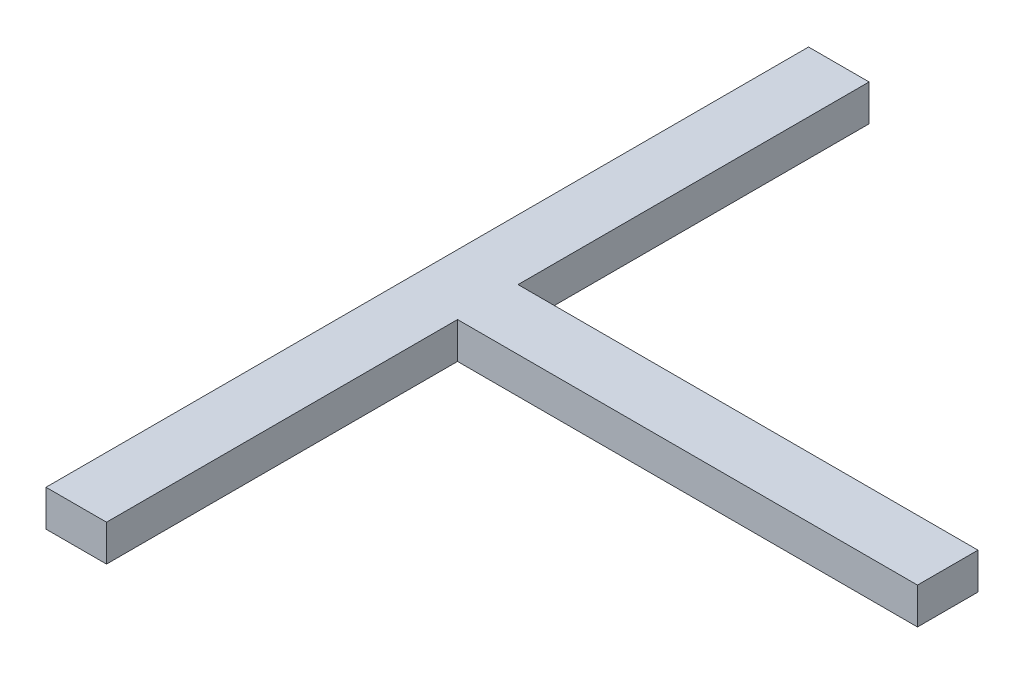
ISO-10303-21;
HEADER;
FILE_DESCRIPTION(('STEP AP214'),'2;1');
FILE_NAME('part.step','',(''),(''),'','','');
FILE_SCHEMA(('AUTOMOTIVE_DESIGN { 1 0 10303 214 1 1 1 1 }'));
ENDSEC;
DATA;
#1=APPLICATION_CONTEXT('core data for automotive mechanical design processes');
#2=APPLICATION_PROTOCOL_DEFINITION('international standard','automotive_design',2000,#1);
#3=PRODUCT_CONTEXT('',#1,'mechanical');
#4=PRODUCT('Part','Part','',(#3));
#5=PRODUCT_RELATED_PRODUCT_CATEGORY('part','',(#4));
#6=PRODUCT_DEFINITION_FORMATION('','',#4);
#7=PRODUCT_DEFINITION_CONTEXT('part definition',#1,'design');
#8=PRODUCT_DEFINITION('design','',#6,#7);
#9=PRODUCT_DEFINITION_SHAPE('','',#8);
#10=(LENGTH_UNIT() NAMED_UNIT(*) SI_UNIT(.MILLI.,.METRE.));
#11=(NAMED_UNIT(*) PLANE_ANGLE_UNIT() SI_UNIT($,.RADIAN.));
#12=(NAMED_UNIT(*) SI_UNIT($,.STERADIAN.) SOLID_ANGLE_UNIT());
#13=UNCERTAINTY_MEASURE_WITH_UNIT(LENGTH_MEASURE(1.E-05),#10,'distance_accuracy_value','');
#14=(GEOMETRIC_REPRESENTATION_CONTEXT(3) GLOBAL_UNCERTAINTY_ASSIGNED_CONTEXT((#13)) GLOBAL_UNIT_ASSIGNED_CONTEXT((#10,
#11,#12)) REPRESENTATION_CONTEXT('',''));
#15=CARTESIAN_POINT('',(0.,0.,0.));
#16=DIRECTION('',(0.,0.,1.));
#17=DIRECTION('',(1.,0.,0.));
#18=AXIS2_PLACEMENT_3D('',#15,#16,#17);
#19=CARTESIAN_POINT('',(-2.5,3.,-31.5));
#20=DIRECTION('',(1.,0.,0.));
#21=DIRECTION('',(0.,0.,-1.));
#22=AXIS2_PLACEMENT_3D('',#19,#20,#21);
#23=PLANE('',#22);
#24=DIRECTION('',(0.,0.,1.));
#25=VECTOR('',#24,1.);
#26=CARTESIAN_POINT('',(-2.5,0.,-31.5));
#27=LINE('',#26,#25);
#28=CARTESIAN_POINT('',(-2.5,0.,-31.5));
#29=VERTEX_POINT('',#28);
#30=CARTESIAN_POINT('',(-2.5,0.,31.5));
#31=VERTEX_POINT('',#30);
#32=EDGE_CURVE('E146',#29,#31,#27,.T.);
#33=ORIENTED_EDGE('',*,*,#32,.T.);
#34=DIRECTION('',(0.,-1.,0.));
#35=VECTOR('',#34,1.);
#36=CARTESIAN_POINT('',(-2.5,3.,31.5));
#37=LINE('',#36,#35);
#38=CARTESIAN_POINT('',(-2.5,3.,31.5));
#39=VERTEX_POINT('',#38);
#40=EDGE_CURVE('E11',#39,#31,#37,.T.);
#41=ORIENTED_EDGE('',*,*,#40,.F.);
#42=DIRECTION('',(0.,0.,1.));
#43=VECTOR('',#42,1.);
#44=CARTESIAN_POINT('',(-2.5,3.,-31.5));
#45=LINE('',#44,#43);
#46=CARTESIAN_POINT('',(-2.5,3.,-31.5));
#47=VERTEX_POINT('',#46);
#48=EDGE_CURVE('E168',#47,#39,#45,.T.);
#49=ORIENTED_EDGE('',*,*,#48,.F.);
#50=DIRECTION('',(0.,-1.,0.));
#51=VECTOR('',#50,1.);
#52=CARTESIAN_POINT('',(-2.5,3.,-31.5));
#53=LINE('',#52,#51);
#54=EDGE_CURVE('E142',#47,#29,#53,.T.);
#55=ORIENTED_EDGE('',*,*,#54,.T.);
#56=EDGE_LOOP('',(#33,#41,#49,#55));
#57=FACE_BOUND('',#56,.T.);
#58=ADVANCED_FACE('F45',(#57),#23,.F.);
#59=CARTESIAN_POINT('',(2.5,3.,31.5));
#60=DIRECTION('',(0.,0.,-1.));
#61=DIRECTION('',(-1.,0.,0.));
#62=AXIS2_PLACEMENT_3D('',#59,#60,#61);
#63=PLANE('',#62);
#64=DIRECTION('',(1.,0.,0.));
#65=VECTOR('',#64,1.);
#66=CARTESIAN_POINT('',(2.5,0.,31.5));
#67=LINE('',#66,#65);
#68=CARTESIAN_POINT('',(2.5,0.,31.5));
#69=VERTEX_POINT('',#68);
#70=EDGE_CURVE('E150',#31,#69,#67,.T.);
#71=ORIENTED_EDGE('',*,*,#70,.T.);
#72=DIRECTION('',(0.,-1.,0.));
#73=VECTOR('',#72,1.);
#74=CARTESIAN_POINT('',(2.5,3.,31.5));
#75=LINE('',#74,#73);
#76=CARTESIAN_POINT('',(2.5,3.,31.5));
#77=VERTEX_POINT('',#76);
#78=EDGE_CURVE('E54',#77,#69,#75,.T.);
#79=ORIENTED_EDGE('',*,*,#78,.F.);
#80=DIRECTION('',(1.,0.,0.));
#81=VECTOR('',#80,1.);
#82=CARTESIAN_POINT('',(2.5,3.,31.5));
#83=LINE('',#82,#81);
#84=EDGE_CURVE('E105',#39,#77,#83,.T.);
#85=ORIENTED_EDGE('',*,*,#84,.F.);
#86=ORIENTED_EDGE('',*,*,#40,.T.);
#87=EDGE_LOOP('',(#71,#79,#85,#86));
#88=FACE_BOUND('',#87,.T.);
#89=ADVANCED_FACE('F214',(#88),#63,.F.);
#90=CARTESIAN_POINT('',(2.5,3.,2.50000000000001));
#91=DIRECTION('',(-1.,0.,0.));
#92=DIRECTION('',(0.,0.,1.));
#93=AXIS2_PLACEMENT_3D('',#90,#91,#92);
#94=PLANE('',#93);
#95=DIRECTION('',(0.,0.,-1.));
#96=VECTOR('',#95,1.);
#97=CARTESIAN_POINT('',(2.5,0.,2.50000000000001));
#98=LINE('',#97,#96);
#99=CARTESIAN_POINT('',(2.5,0.,2.50000000000001));
#100=VERTEX_POINT('',#99);
#101=EDGE_CURVE('E153',#69,#100,#98,.T.);
#102=ORIENTED_EDGE('',*,*,#101,.T.);
#103=DIRECTION('',(0.,-1.,0.));
#104=VECTOR('',#103,1.);
#105=CARTESIAN_POINT('',(2.5,3.,2.50000000000001));
#106=LINE('',#105,#104);
#107=CARTESIAN_POINT('',(2.5,3.,2.50000000000001));
#108=VERTEX_POINT('',#107);
#109=EDGE_CURVE('E179',#108,#100,#106,.T.);
#110=ORIENTED_EDGE('',*,*,#109,.F.);
#111=DIRECTION('',(0.,0.,-1.));
#112=VECTOR('',#111,1.);
#113=CARTESIAN_POINT('',(2.5,3.,2.50000000000001));
#114=LINE('',#113,#112);
#115=EDGE_CURVE('E189',#77,#108,#114,.T.);
#116=ORIENTED_EDGE('',*,*,#115,.F.);
#117=ORIENTED_EDGE('',*,*,#78,.T.);
#118=EDGE_LOOP('',(#102,#110,#116,#117));
#119=FACE_BOUND('',#118,.T.);
#120=ADVANCED_FACE('F187',(#119),#94,.F.);
#121=CARTESIAN_POINT('',(2.5,3.,2.50000000000001));
#122=DIRECTION('',(0.,0.,-1.));
#123=DIRECTION('',(-1.,0.,0.));
#124=AXIS2_PLACEMENT_3D('',#121,#122,#123);
#125=PLANE('',#124);
#126=DIRECTION('',(1.,0.,0.));
#127=VECTOR('',#126,1.);
#128=CARTESIAN_POINT('',(2.5,0.,2.50000000000001));
#129=LINE('',#128,#127);
#130=CARTESIAN_POINT('',(40.5,0.,2.50000000000001));
#131=VERTEX_POINT('',#130);
#132=EDGE_CURVE('E156',#100,#131,#129,.T.);
#133=ORIENTED_EDGE('',*,*,#132,.T.);
#134=DIRECTION('',(0.,-1.,0.));
#135=VECTOR('',#134,1.);
#136=CARTESIAN_POINT('',(40.5,3.,2.50000000000001));
#137=LINE('',#136,#135);
#138=CARTESIAN_POINT('',(40.5,3.,2.50000000000001));
#139=VERTEX_POINT('',#138);
#140=EDGE_CURVE('E175',#139,#131,#137,.T.);
#141=ORIENTED_EDGE('',*,*,#140,.F.);
#142=DIRECTION('',(1.,0.,0.));
#143=VECTOR('',#142,1.);
#144=CARTESIAN_POINT('',(2.5,3.,2.50000000000001));
#145=LINE('',#144,#143);
#146=EDGE_CURVE('E202',#108,#139,#145,.T.);
#147=ORIENTED_EDGE('',*,*,#146,.F.);
#148=ORIENTED_EDGE('',*,*,#109,.T.);
#149=EDGE_LOOP('',(#133,#141,#147,#148));
#150=FACE_BOUND('',#149,.T.);
#151=ADVANCED_FACE('F197',(#150),#125,.F.);
#152=CARTESIAN_POINT('',(40.5,3.,-2.49999999999999));
#153=DIRECTION('',(-1.,0.,0.));
#154=DIRECTION('',(0.,0.,1.));
#155=AXIS2_PLACEMENT_3D('',#152,#153,#154);
#156=PLANE('',#155);
#157=DIRECTION('',(0.,0.,-1.));
#158=VECTOR('',#157,1.);
#159=CARTESIAN_POINT('',(40.5,0.,-2.49999999999999));
#160=LINE('',#159,#158);
#161=CARTESIAN_POINT('',(40.5,0.,-2.49999999999999));
#162=VERTEX_POINT('',#161);
#163=EDGE_CURVE('E159',#131,#162,#160,.T.);
#164=ORIENTED_EDGE('',*,*,#163,.T.);
#165=DIRECTION('',(0.,-1.,0.));
#166=VECTOR('',#165,1.);
#167=CARTESIAN_POINT('',(40.5,3.,-2.49999999999999));
#168=LINE('',#167,#166);
#169=CARTESIAN_POINT('',(40.5,3.,-2.49999999999999));
#170=VERTEX_POINT('',#169);
#171=EDGE_CURVE('E135',#170,#162,#168,.T.);
#172=ORIENTED_EDGE('',*,*,#171,.F.);
#173=DIRECTION('',(0.,0.,-1.));
#174=VECTOR('',#173,1.);
#175=CARTESIAN_POINT('',(40.5,3.,-2.49999999999999));
#176=LINE('',#175,#174);
#177=EDGE_CURVE('E124',#139,#170,#176,.T.);
#178=ORIENTED_EDGE('',*,*,#177,.F.);
#179=ORIENTED_EDGE('',*,*,#140,.T.);
#180=EDGE_LOOP('',(#164,#172,#178,#179));
#181=FACE_BOUND('',#180,.T.);
#182=ADVANCED_FACE('F200',(#181),#156,.F.);
#183=CARTESIAN_POINT('',(2.5,3.,-2.49999999999999));
#184=DIRECTION('',(0.,0.,1.));
#185=DIRECTION('',(1.,0.,0.));
#186=AXIS2_PLACEMENT_3D('',#183,#184,#185);
#187=PLANE('',#186);
#188=DIRECTION('',(-1.,0.,0.));
#189=VECTOR('',#188,1.);
#190=CARTESIAN_POINT('',(2.5,0.,-2.49999999999999));
#191=LINE('',#190,#189);
#192=CARTESIAN_POINT('',(2.5,0.,-2.49999999999999));
#193=VERTEX_POINT('',#192);
#194=EDGE_CURVE('E133',#162,#193,#191,.T.);
#195=ORIENTED_EDGE('',*,*,#194,.T.);
#196=DIRECTION('',(0.,-1.,0.));
#197=VECTOR('',#196,1.);
#198=CARTESIAN_POINT('',(2.5,3.,-2.49999999999999));
#199=LINE('',#198,#197);
#200=CARTESIAN_POINT('',(2.5,3.,-2.49999999999999));
#201=VERTEX_POINT('',#200);
#202=EDGE_CURVE('E130',#201,#193,#199,.T.);
#203=ORIENTED_EDGE('',*,*,#202,.F.);
#204=DIRECTION('',(-1.,0.,0.));
#205=VECTOR('',#204,1.);
#206=CARTESIAN_POINT('',(2.5,3.,-2.49999999999999));
#207=LINE('',#206,#205);
#208=EDGE_CURVE('E118',#170,#201,#207,.T.);
#209=ORIENTED_EDGE('',*,*,#208,.F.);
#210=ORIENTED_EDGE('',*,*,#171,.T.);
#211=EDGE_LOOP('',(#195,#203,#209,#210));
#212=FACE_BOUND('',#211,.T.);
#213=ADVANCED_FACE('F131',(#212),#187,.F.);
#214=CARTESIAN_POINT('',(2.5,3.,-31.5));
#215=DIRECTION('',(-1.,0.,0.));
#216=DIRECTION('',(0.,0.,1.));
#217=AXIS2_PLACEMENT_3D('',#214,#215,#216);
#218=PLANE('',#217);
#219=DIRECTION('',(0.,0.,-1.));
#220=VECTOR('',#219,1.);
#221=CARTESIAN_POINT('',(2.5,0.,-31.5));
#222=LINE('',#221,#220);
#223=CARTESIAN_POINT('',(2.5,0.,-31.5));
#224=VERTEX_POINT('',#223);
#225=EDGE_CURVE('E91',#193,#224,#222,.T.);
#226=ORIENTED_EDGE('',*,*,#225,.T.);
#227=DIRECTION('',(0.,-1.,0.));
#228=VECTOR('',#227,1.);
#229=CARTESIAN_POINT('',(2.5,3.,-31.5));
#230=LINE('',#229,#228);
#231=CARTESIAN_POINT('',(2.5,3.,-31.5));
#232=VERTEX_POINT('',#231);
#233=EDGE_CURVE('E136',#232,#224,#230,.T.);
#234=ORIENTED_EDGE('',*,*,#233,.F.);
#235=DIRECTION('',(0.,0.,-1.));
#236=VECTOR('',#235,1.);
#237=CARTESIAN_POINT('',(2.5,3.,-31.5));
#238=LINE('',#237,#236);
#239=EDGE_CURVE('E122',#201,#232,#238,.T.);
#240=ORIENTED_EDGE('',*,*,#239,.F.);
#241=ORIENTED_EDGE('',*,*,#202,.T.);
#242=EDGE_LOOP('',(#226,#234,#240,#241));
#243=FACE_BOUND('',#242,.T.);
#244=ADVANCED_FACE('F138',(#243),#218,.F.);
#245=CARTESIAN_POINT('',(2.5,3.,-31.5));
#246=DIRECTION('',(0.,0.,1.));
#247=DIRECTION('',(1.,0.,0.));
#248=AXIS2_PLACEMENT_3D('',#245,#246,#247);
#249=PLANE('',#248);
#250=DIRECTION('',(-1.,0.,0.));
#251=VECTOR('',#250,1.);
#252=CARTESIAN_POINT('',(2.5,0.,-31.5));
#253=LINE('',#252,#251);
#254=EDGE_CURVE('E97',#224,#29,#253,.T.);
#255=ORIENTED_EDGE('',*,*,#254,.T.);
#256=ORIENTED_EDGE('',*,*,#54,.F.);
#257=DIRECTION('',(-1.,0.,0.));
#258=VECTOR('',#257,1.);
#259=CARTESIAN_POINT('',(2.5,3.,-31.5));
#260=LINE('',#259,#258);
#261=EDGE_CURVE('E62',#232,#47,#260,.T.);
#262=ORIENTED_EDGE('',*,*,#261,.F.);
#263=ORIENTED_EDGE('',*,*,#233,.T.);
#264=EDGE_LOOP('',(#255,#256,#262,#263));
#265=FACE_BOUND('',#264,.T.);
#266=ADVANCED_FACE('F230',(#265),#249,.F.);
#267=CARTESIAN_POINT('',(0.,3.,0.));
#268=DIRECTION('',(0.,-1.,0.));
#269=DIRECTION('',(0.,0.,-1.));
#270=AXIS2_PLACEMENT_3D('',#267,#268,#269);
#271=PLANE('',#270);
#272=ORIENTED_EDGE('',*,*,#48,.T.);
#273=ORIENTED_EDGE('',*,*,#84,.T.);
#274=ORIENTED_EDGE('',*,*,#115,.T.);
#275=ORIENTED_EDGE('',*,*,#146,.T.);
#276=ORIENTED_EDGE('',*,*,#177,.T.);
#277=ORIENTED_EDGE('',*,*,#208,.T.);
#278=ORIENTED_EDGE('',*,*,#239,.T.);
#279=ORIENTED_EDGE('',*,*,#261,.T.);
#280=EDGE_LOOP('',(#272,#273,#274,#275,#276,#277,#278,#279));
#281=FACE_BOUND('',#280,.T.);
#282=ADVANCED_FACE('F120',(#281),#271,.F.);
#283=CARTESIAN_POINT('',(0.,0.,0.));
#284=DIRECTION('',(0.,-1.,0.));
#285=DIRECTION('',(0.,0.,-1.));
#286=AXIS2_PLACEMENT_3D('',#283,#284,#285);
#287=PLANE('',#286);
#288=ORIENTED_EDGE('',*,*,#32,.F.);
#289=ORIENTED_EDGE('',*,*,#254,.F.);
#290=ORIENTED_EDGE('',*,*,#225,.F.);
#291=ORIENTED_EDGE('',*,*,#194,.F.);
#292=ORIENTED_EDGE('',*,*,#163,.F.);
#293=ORIENTED_EDGE('',*,*,#132,.F.);
#294=ORIENTED_EDGE('',*,*,#101,.F.);
#295=ORIENTED_EDGE('',*,*,#70,.F.);
#296=EDGE_LOOP('',(#288,#289,#290,#291,#292,#293,#294,#295));
#297=FACE_BOUND('',#296,.T.);
#298=ADVANCED_FACE('F193',(#297),#287,.T.);
#299=CLOSED_SHELL('',(#58,#89,#120,#151,#182,#213,#244,#266,#282,#298));
#300=MANIFOLD_SOLID_BREP('B2',#299);
#301=ADVANCED_BREP_SHAPE_REPRESENTATION('',(#18,#300),#14);
#302=SHAPE_DEFINITION_REPRESENTATION(#9,#301);
ENDSEC;
END-ISO-10303-21;
